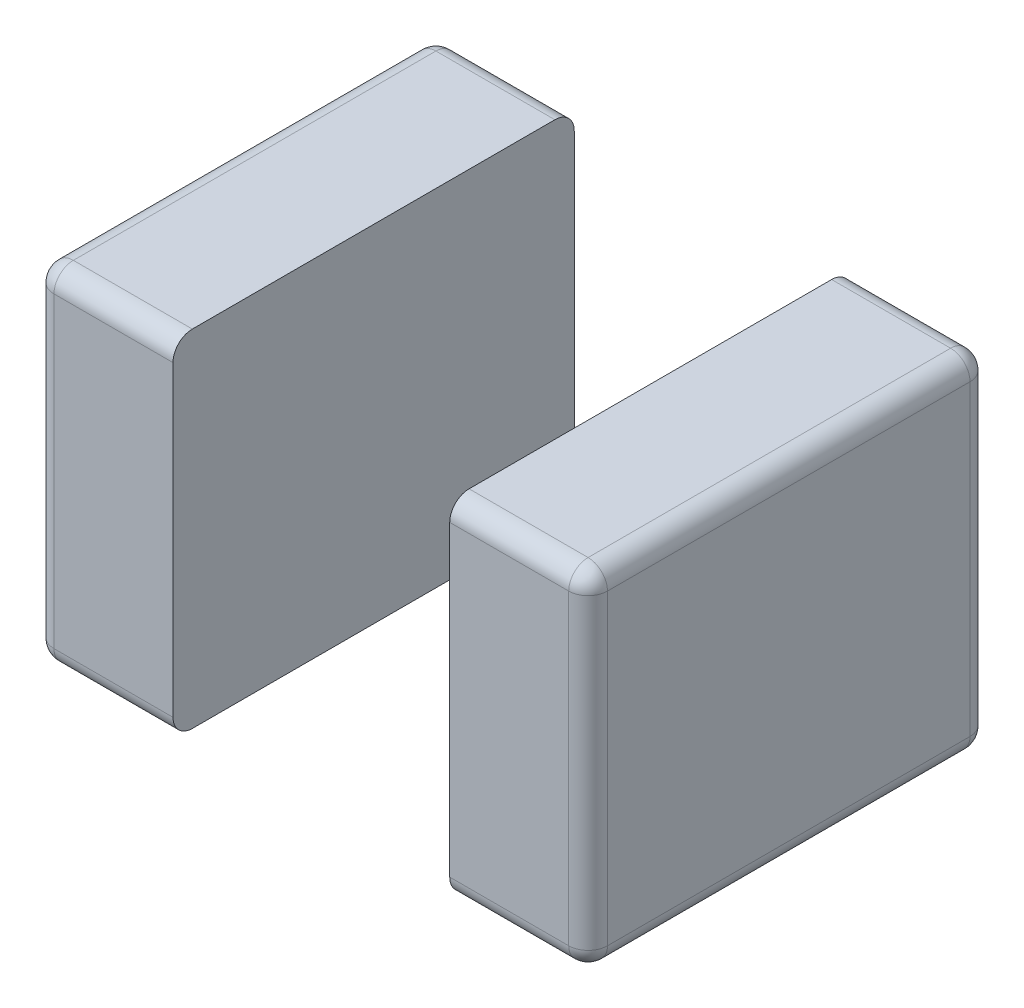
ISO-10303-21;
HEADER;
FILE_DESCRIPTION(('STEP AP214'),'2;1');
FILE_NAME('part.step','',(''),(''),'','','');
FILE_SCHEMA(('AUTOMOTIVE_DESIGN { 1 0 10303 214 1 1 1 1 }'));
ENDSEC;
DATA;
#1=APPLICATION_CONTEXT('core data for automotive mechanical design processes');
#2=APPLICATION_PROTOCOL_DEFINITION('international standard','automotive_design',2000,#1);
#3=PRODUCT_CONTEXT('',#1,'mechanical');
#4=PRODUCT('Part','Part','',(#3));
#5=PRODUCT_RELATED_PRODUCT_CATEGORY('part','',(#4));
#6=PRODUCT_DEFINITION_FORMATION('','',#4);
#7=PRODUCT_DEFINITION_CONTEXT('part definition',#1,'design');
#8=PRODUCT_DEFINITION('design','',#6,#7);
#9=PRODUCT_DEFINITION_SHAPE('','',#8);
#10=(LENGTH_UNIT() NAMED_UNIT(*) SI_UNIT(.MILLI.,.METRE.));
#11=(NAMED_UNIT(*) PLANE_ANGLE_UNIT() SI_UNIT($,.RADIAN.));
#12=(NAMED_UNIT(*) SI_UNIT($,.STERADIAN.) SOLID_ANGLE_UNIT());
#13=UNCERTAINTY_MEASURE_WITH_UNIT(LENGTH_MEASURE(1.E-05),#10,'distance_accuracy_value','');
#14=(GEOMETRIC_REPRESENTATION_CONTEXT(3) GLOBAL_UNCERTAINTY_ASSIGNED_CONTEXT((#13)) GLOBAL_UNIT_ASSIGNED_CONTEXT((#10,
#11,#12)) REPRESENTATION_CONTEXT('',''));
#15=CARTESIAN_POINT('',(0.,0.,0.));
#16=DIRECTION('',(0.,0.,1.));
#17=DIRECTION('',(1.,0.,0.));
#18=AXIS2_PLACEMENT_3D('',#15,#16,#17);
#19=CARTESIAN_POINT('',(-1.,0.625,0.));
#20=DIRECTION('',(-1.,0.,0.));
#21=DIRECTION('',(0.,-1.,0.));
#22=AXIS2_PLACEMENT_3D('',#19,#20,#21);
#23=PLANE('',#22);
#24=DIRECTION('',(0.,-1.,0.));
#25=VECTOR('',#24,1.);
#26=CARTESIAN_POINT('',(-1.,0.3125,1.38));
#27=LINE('',#26,#25);
#28=CARTESIAN_POINT('',(-1.,0.555,1.38));
#29=VERTEX_POINT('',#28);
#30=CARTESIAN_POINT('',(-1.,-0.555,1.38));
#31=VERTEX_POINT('',#30);
#32=EDGE_CURVE('P0_E183',#29,#31,#27,.T.);
#33=ORIENTED_EDGE('',*,*,#32,.F.);
#34=DIRECTION('',(0.,0.,1.));
#35=VECTOR('',#34,1.);
#36=CARTESIAN_POINT('',(-1.,0.555,0.));
#37=LINE('',#36,#35);
#38=CARTESIAN_POINT('',(-1.,0.555,0.07));
#39=VERTEX_POINT('',#38);
#40=EDGE_CURVE('P0_E103',#39,#29,#37,.T.);
#41=ORIENTED_EDGE('',*,*,#40,.F.);
#42=DIRECTION('',(0.,-1.,0.));
#43=VECTOR('',#42,1.);
#44=CARTESIAN_POINT('',(-1.,0.3125,0.07));
#45=LINE('',#44,#43);
#46=CARTESIAN_POINT('',(-1.,-0.555,0.07));
#47=VERTEX_POINT('',#46);
#48=EDGE_CURVE('P0_E175',#47,#39,#45,.F.);
#49=ORIENTED_EDGE('',*,*,#48,.F.);
#50=DIRECTION('',(0.,0.,1.));
#51=VECTOR('',#50,1.);
#52=CARTESIAN_POINT('',(-1.,-0.555,0.));
#53=LINE('',#52,#51);
#54=EDGE_CURVE('P0_E179',#31,#47,#53,.F.);
#55=ORIENTED_EDGE('',*,*,#54,.F.);
#56=EDGE_LOOP('',(#33,#41,#49,#55));
#57=FACE_BOUND('',#56,.T.);
#58=ADVANCED_FACE('P0_F17',(#57),#23,.T.);
#59=CARTESIAN_POINT('',(-0.93,0.555,0.07));
#60=DIRECTION('',(-0.577350269189626,0.577350269189626,-0.577350269189626));
#61=DIRECTION('',(0.707106781186548,0.707106781186548,0.));
#62=AXIS2_PLACEMENT_3D('',#59,#60,#61);
#63=SPHERICAL_SURFACE('',#62,0.07);
#64=CARTESIAN_POINT('',(-0.970414518843274,0.595414518843274,0.0295854811567262));
#65=VERTEX_POINT('',#64);
#66=VERTEX_LOOP('',#65);
#67=FACE_BOUND('',#66,.T.);
#68=CARTESIAN_POINT('',(-0.93,0.555,0.07));
#69=DIRECTION('',(-1.,0.,0.));
#70=DIRECTION('',(0.,-1.,0.));
#71=AXIS2_PLACEMENT_3D('',#68,#69,#70);
#72=CIRCLE('',#71,0.07);
#73=CARTESIAN_POINT('',(-0.93,0.555,0.));
#74=VERTEX_POINT('',#73);
#75=CARTESIAN_POINT('',(-0.93,0.625,0.07));
#76=VERTEX_POINT('',#75);
#77=EDGE_CURVE('P0_E98',#74,#76,#72,.F.);
#78=ORIENTED_EDGE('',*,*,#77,.F.);
#79=CARTESIAN_POINT('',(-0.93,0.555,0.07));
#80=DIRECTION('',(0.,-1.,0.));
#81=DIRECTION('',(1.,0.,0.));
#82=AXIS2_PLACEMENT_3D('',#79,#80,#81);
#83=CIRCLE('',#82,0.07);
#84=EDGE_CURVE('P0_E100',#39,#74,#83,.T.);
#85=ORIENTED_EDGE('',*,*,#84,.F.);
#86=CARTESIAN_POINT('',(-0.93,0.555,0.07));
#87=DIRECTION('',(0.,0.,1.));
#88=DIRECTION('',(1.,0.,0.));
#89=AXIS2_PLACEMENT_3D('',#86,#87,#88);
#90=CIRCLE('',#89,0.07);
#91=EDGE_CURVE('P0_E20',#76,#39,#90,.T.);
#92=ORIENTED_EDGE('',*,*,#91,.F.);
#93=EDGE_LOOP('',(#78,#85,#92));
#94=FACE_BOUND('',#93,.T.);
#95=ADVANCED_FACE('P0_F97',(#67,#94),#63,.T.);
#96=CARTESIAN_POINT('',(-0.93,0.555,0.));
#97=DIRECTION('',(0.,0.,1.));
#98=DIRECTION('',(1.,0.,0.));
#99=AXIS2_PLACEMENT_3D('',#96,#97,#98);
#100=CYLINDRICAL_SURFACE('',#99,0.07);
#101=ORIENTED_EDGE('',*,*,#91,.T.);
#102=ORIENTED_EDGE('',*,*,#40,.T.);
#103=CARTESIAN_POINT('',(-0.93,0.555,1.38));
#104=DIRECTION('',(0.,0.,1.));
#105=DIRECTION('',(1.,0.,0.));
#106=AXIS2_PLACEMENT_3D('',#103,#104,#105);
#107=CIRCLE('',#106,0.07);
#108=CARTESIAN_POINT('',(-0.93,0.625,1.38));
#109=VERTEX_POINT('',#108);
#110=EDGE_CURVE('P0_E118',#109,#29,#107,.T.);
#111=ORIENTED_EDGE('',*,*,#110,.F.);
#112=DIRECTION('',(0.,0.,1.));
#113=VECTOR('',#112,1.);
#114=CARTESIAN_POINT('',(-0.93,0.625,0.));
#115=LINE('',#114,#113);
#116=EDGE_CURVE('P0_E115',#76,#109,#115,.T.);
#117=ORIENTED_EDGE('',*,*,#116,.F.);
#118=EDGE_LOOP('',(#101,#102,#111,#117));
#119=FACE_BOUND('',#118,.T.);
#120=ADVANCED_FACE('P0_F116',(#119),#100,.T.);
#121=CARTESIAN_POINT('',(-0.93,0.555,1.38));
#122=DIRECTION('',(-0.577350269189626,0.577350269189626,0.577350269189626));
#123=DIRECTION('',(-0.707106781186548,0.,-0.707106781186548));
#124=AXIS2_PLACEMENT_3D('',#121,#122,#123);
#125=SPHERICAL_SURFACE('',#124,0.07);
#126=CARTESIAN_POINT('',(-0.970414518843274,0.595414518843274,1.42041451884327));
#127=VERTEX_POINT('',#126);
#128=VERTEX_LOOP('',#127);
#129=FACE_BOUND('',#128,.T.);
#130=ORIENTED_EDGE('',*,*,#110,.T.);
#131=CARTESIAN_POINT('',(-0.93,0.555,1.38));
#132=DIRECTION('',(0.,-1.,0.));
#133=DIRECTION('',(1.,0.,0.));
#134=AXIS2_PLACEMENT_3D('',#131,#132,#133);
#135=CIRCLE('',#134,0.07);
#136=CARTESIAN_POINT('',(-0.93,0.555,1.45));
#137=VERTEX_POINT('',#136);
#138=EDGE_CURVE('P0_E186',#137,#29,#135,.T.);
#139=ORIENTED_EDGE('',*,*,#138,.F.);
#140=CARTESIAN_POINT('',(-0.93,0.555,1.38));
#141=DIRECTION('',(-1.,0.,0.));
#142=DIRECTION('',(0.,-1.,0.));
#143=AXIS2_PLACEMENT_3D('',#140,#141,#142);
#144=CIRCLE('',#143,0.07);
#145=EDGE_CURVE('P0_E206',#109,#137,#144,.F.);
#146=ORIENTED_EDGE('',*,*,#145,.F.);
#147=EDGE_LOOP('',(#130,#139,#146));
#148=FACE_BOUND('',#147,.T.);
#149=ADVANCED_FACE('P0_F166',(#129,#148),#125,.T.);
#150=CARTESIAN_POINT('',(-0.93,0.3125,1.38));
#151=DIRECTION('',(0.,-1.,0.));
#152=DIRECTION('',(1.,0.,0.));
#153=AXIS2_PLACEMENT_3D('',#150,#151,#152);
#154=CYLINDRICAL_SURFACE('',#153,0.07);
#155=ORIENTED_EDGE('',*,*,#138,.T.);
#156=ORIENTED_EDGE('',*,*,#32,.T.);
#157=CARTESIAN_POINT('',(-0.93,-0.555,1.38));
#158=DIRECTION('',(0.,-1.,0.));
#159=DIRECTION('',(1.,0.,0.));
#160=AXIS2_PLACEMENT_3D('',#157,#158,#159);
#161=CIRCLE('',#160,0.07);
#162=CARTESIAN_POINT('',(-0.93,-0.555,1.45));
#163=VERTEX_POINT('',#162);
#164=EDGE_CURVE('P0_E185',#163,#31,#161,.T.);
#165=ORIENTED_EDGE('',*,*,#164,.F.);
#166=DIRECTION('',(0.,1.,0.));
#167=VECTOR('',#166,1.);
#168=CARTESIAN_POINT('',(-0.93,0.,1.45));
#169=LINE('',#168,#167);
#170=EDGE_CURVE('P0_E159',#137,#163,#169,.F.);
#171=ORIENTED_EDGE('',*,*,#170,.F.);
#172=EDGE_LOOP('',(#155,#156,#165,#171));
#173=FACE_BOUND('',#172,.T.);
#174=ADVANCED_FACE('P0_F154',(#173),#154,.T.);
#175=CARTESIAN_POINT('',(-0.93,-0.555,1.38));
#176=DIRECTION('',(-0.577350269189626,-0.577350269189626,0.577350269189626));
#177=DIRECTION('',(-0.707106781186548,0.,-0.707106781186548));
#178=AXIS2_PLACEMENT_3D('',#175,#176,#177);
#179=SPHERICAL_SURFACE('',#178,0.07);
#180=CARTESIAN_POINT('',(-0.970414518843274,-0.595414518843274,1.42041451884327));
#181=VERTEX_POINT('',#180);
#182=VERTEX_LOOP('',#181);
#183=FACE_BOUND('',#182,.T.);
#184=CARTESIAN_POINT('',(-0.93,-0.555,1.38));
#185=DIRECTION('',(0.,0.,1.));
#186=DIRECTION('',(1.,0.,0.));
#187=AXIS2_PLACEMENT_3D('',#184,#185,#186);
#188=CIRCLE('',#187,0.07);
#189=CARTESIAN_POINT('',(-0.93,-0.625,1.38));
#190=VERTEX_POINT('',#189);
#191=EDGE_CURVE('P0_E182',#190,#31,#188,.F.);
#192=ORIENTED_EDGE('',*,*,#191,.F.);
#193=CARTESIAN_POINT('',(-0.93,-0.555,1.38));
#194=DIRECTION('',(1.,0.,0.));
#195=DIRECTION('',(0.,1.,0.));
#196=AXIS2_PLACEMENT_3D('',#193,#194,#195);
#197=CIRCLE('',#196,0.07);
#198=EDGE_CURVE('P0_E202',#163,#190,#197,.T.);
#199=ORIENTED_EDGE('',*,*,#198,.F.);
#200=ORIENTED_EDGE('',*,*,#164,.T.);
#201=EDGE_LOOP('',(#192,#199,#200));
#202=FACE_BOUND('',#201,.T.);
#203=ADVANCED_FACE('P0_F150',(#183,#202),#179,.T.);
#204=CARTESIAN_POINT('',(-0.93,-0.555,0.));
#205=DIRECTION('',(0.,0.,1.));
#206=DIRECTION('',(1.,0.,0.));
#207=AXIS2_PLACEMENT_3D('',#204,#205,#206);
#208=CYLINDRICAL_SURFACE('',#207,0.07);
#209=CARTESIAN_POINT('',(-0.93,-0.555,0.07));
#210=DIRECTION('',(0.,0.,1.));
#211=DIRECTION('',(1.,0.,0.));
#212=AXIS2_PLACEMENT_3D('',#209,#210,#211);
#213=CIRCLE('',#212,0.07);
#214=CARTESIAN_POINT('',(-0.93,-0.625,0.07));
#215=VERTEX_POINT('',#214);
#216=EDGE_CURVE('P0_E181',#215,#47,#213,.F.);
#217=ORIENTED_EDGE('',*,*,#216,.F.);
#218=DIRECTION('',(0.,0.,1.));
#219=VECTOR('',#218,1.);
#220=CARTESIAN_POINT('',(-0.93,-0.625,0.));
#221=LINE('',#220,#219);
#222=EDGE_CURVE('P0_E137',#190,#215,#221,.F.);
#223=ORIENTED_EDGE('',*,*,#222,.F.);
#224=ORIENTED_EDGE('',*,*,#191,.T.);
#225=ORIENTED_EDGE('',*,*,#54,.T.);
#226=EDGE_LOOP('',(#217,#223,#224,#225));
#227=FACE_BOUND('',#226,.T.);
#228=ADVANCED_FACE('P0_F145',(#227),#208,.T.);
#229=CARTESIAN_POINT('',(-0.93,-0.555,0.07));
#230=DIRECTION('',(-0.577350269189626,-0.577350269189626,-0.577350269189626));
#231=DIRECTION('',(0.,-0.707106781186548,0.707106781186548));
#232=AXIS2_PLACEMENT_3D('',#229,#230,#231);
#233=SPHERICAL_SURFACE('',#232,0.07);
#234=CARTESIAN_POINT('',(-0.970414518843274,-0.595414518843274,0.0295854811567262));
#235=VERTEX_POINT('',#234);
#236=VERTEX_LOOP('',#235);
#237=FACE_BOUND('',#236,.T.);
#238=CARTESIAN_POINT('',(-0.93,-0.555,0.07));
#239=DIRECTION('',(1.,0.,0.));
#240=DIRECTION('',(0.,1.,0.));
#241=AXIS2_PLACEMENT_3D('',#238,#239,#240);
#242=CIRCLE('',#241,0.07);
#243=CARTESIAN_POINT('',(-0.93,-0.555,0.));
#244=VERTEX_POINT('',#243);
#245=EDGE_CURVE('P0_E134',#215,#244,#242,.T.);
#246=ORIENTED_EDGE('',*,*,#245,.F.);
#247=ORIENTED_EDGE('',*,*,#216,.T.);
#248=CARTESIAN_POINT('',(-0.93,-0.555,0.07));
#249=DIRECTION('',(0.,-1.,0.));
#250=DIRECTION('',(1.,0.,0.));
#251=AXIS2_PLACEMENT_3D('',#248,#249,#250);
#252=CIRCLE('',#251,0.07);
#253=EDGE_CURVE('P0_E178',#244,#47,#252,.F.);
#254=ORIENTED_EDGE('',*,*,#253,.F.);
#255=EDGE_LOOP('',(#246,#247,#254));
#256=FACE_BOUND('',#255,.T.);
#257=ADVANCED_FACE('P0_F140',(#237,#256),#233,.T.);
#258=CARTESIAN_POINT('',(-0.93,0.3125,0.07));
#259=DIRECTION('',(0.,-1.,0.));
#260=DIRECTION('',(1.,0.,0.));
#261=AXIS2_PLACEMENT_3D('',#258,#259,#260);
#262=CYLINDRICAL_SURFACE('',#261,0.07);
#263=ORIENTED_EDGE('',*,*,#84,.T.);
#264=DIRECTION('',(0.,1.,0.));
#265=VECTOR('',#264,1.);
#266=CARTESIAN_POINT('',(-0.93,0.,0.));
#267=LINE('',#266,#265);
#268=EDGE_CURVE('P0_E131',#74,#244,#267,.F.);
#269=ORIENTED_EDGE('',*,*,#268,.T.);
#270=ORIENTED_EDGE('',*,*,#253,.T.);
#271=ORIENTED_EDGE('',*,*,#48,.T.);
#272=EDGE_LOOP('',(#263,#269,#270,#271));
#273=FACE_BOUND('',#272,.T.);
#274=ADVANCED_FACE('P0_F144',(#273),#262,.T.);
#275=CARTESIAN_POINT('',(-0.625,0.555,0.07));
#276=DIRECTION('',(-1.,0.,0.));
#277=DIRECTION('',(0.,-1.,0.));
#278=AXIS2_PLACEMENT_3D('',#275,#276,#277);
#279=CYLINDRICAL_SURFACE('',#278,0.07);
#280=ORIENTED_EDGE('',*,*,#77,.T.);
#281=DIRECTION('',(-1.,0.,0.));
#282=VECTOR('',#281,1.);
#283=CARTESIAN_POINT('',(-0.5,0.625,0.07));
#284=LINE('',#283,#282);
#285=CARTESIAN_POINT('',(-0.5,0.625,0.07));
#286=VERTEX_POINT('',#285);
#287=EDGE_CURVE('P0_E108',#286,#76,#284,.T.);
#288=ORIENTED_EDGE('',*,*,#287,.F.);
#289=CARTESIAN_POINT('',(-0.5,0.555,0.07));
#290=DIRECTION('',(-1.,0.,0.));
#291=DIRECTION('',(0.,-1.,0.));
#292=AXIS2_PLACEMENT_3D('',#289,#290,#291);
#293=CIRCLE('',#292,0.07);
#294=CARTESIAN_POINT('',(-0.5,0.555,0.));
#295=VERTEX_POINT('',#294);
#296=EDGE_CURVE('P0_E198',#295,#286,#293,.F.);
#297=ORIENTED_EDGE('',*,*,#296,.F.);
#298=DIRECTION('',(1.,0.,0.));
#299=VECTOR('',#298,1.);
#300=CARTESIAN_POINT('',(-0.75,0.555,0.));
#301=LINE('',#300,#299);
#302=EDGE_CURVE('P0_E111',#295,#74,#301,.F.);
#303=ORIENTED_EDGE('',*,*,#302,.T.);
#304=EDGE_LOOP('',(#280,#288,#297,#303));
#305=FACE_BOUND('',#304,.T.);
#306=ADVANCED_FACE('P0_F106',(#305),#279,.T.);
#307=CARTESIAN_POINT('',(-0.5,0.625,0.));
#308=DIRECTION('',(0.,1.,0.));
#309=DIRECTION('',(-1.,0.,0.));
#310=AXIS2_PLACEMENT_3D('',#307,#308,#309);
#311=PLANE('',#310);
#312=DIRECTION('',(-1.,0.,0.));
#313=VECTOR('',#312,1.);
#314=CARTESIAN_POINT('',(-0.625,0.625,1.38));
#315=LINE('',#314,#313);
#316=CARTESIAN_POINT('',(-0.5,0.625,1.38));
#317=VERTEX_POINT('',#316);
#318=EDGE_CURVE('P0_E121',#317,#109,#315,.T.);
#319=ORIENTED_EDGE('',*,*,#318,.F.);
#320=DIRECTION('',(0.,0.,1.));
#321=VECTOR('',#320,1.);
#322=CARTESIAN_POINT('',(-0.5,0.625,0.));
#323=LINE('',#322,#321);
#324=EDGE_CURVE('P0_E125',#286,#317,#323,.T.);
#325=ORIENTED_EDGE('',*,*,#324,.F.);
#326=ORIENTED_EDGE('',*,*,#287,.T.);
#327=ORIENTED_EDGE('',*,*,#116,.T.);
#328=EDGE_LOOP('',(#319,#325,#326,#327));
#329=FACE_BOUND('',#328,.T.);
#330=ADVANCED_FACE('P0_F123',(#329),#311,.T.);
#331=CARTESIAN_POINT('',(-0.625,0.555,1.38));
#332=DIRECTION('',(-1.,0.,0.));
#333=DIRECTION('',(0.,-1.,0.));
#334=AXIS2_PLACEMENT_3D('',#331,#332,#333);
#335=CYLINDRICAL_SURFACE('',#334,0.07);
#336=ORIENTED_EDGE('',*,*,#145,.T.);
#337=DIRECTION('',(1.,0.,0.));
#338=VECTOR('',#337,1.);
#339=CARTESIAN_POINT('',(-0.75,0.555,1.45));
#340=LINE('',#339,#338);
#341=CARTESIAN_POINT('',(-0.5,0.555,1.45));
#342=VERTEX_POINT('',#341);
#343=EDGE_CURVE('P0_E163',#342,#137,#340,.F.);
#344=ORIENTED_EDGE('',*,*,#343,.F.);
#345=CARTESIAN_POINT('',(-0.5,0.555,1.38));
#346=DIRECTION('',(-1.,0.,0.));
#347=DIRECTION('',(0.,-1.,0.));
#348=AXIS2_PLACEMENT_3D('',#345,#346,#347);
#349=CIRCLE('',#348,0.07);
#350=EDGE_CURVE('P0_E195',#317,#342,#349,.F.);
#351=ORIENTED_EDGE('',*,*,#350,.F.);
#352=ORIENTED_EDGE('',*,*,#318,.T.);
#353=EDGE_LOOP('',(#336,#344,#351,#352));
#354=FACE_BOUND('',#353,.T.);
#355=ADVANCED_FACE('P0_F311',(#354),#335,.T.);
#356=CARTESIAN_POINT('',(-0.75,0.,1.45));
#357=DIRECTION('',(0.,0.,1.));
#358=DIRECTION('',(1.,0.,0.));
#359=AXIS2_PLACEMENT_3D('',#356,#357,#358);
#360=PLANE('',#359);
#361=DIRECTION('',(1.,0.,0.));
#362=VECTOR('',#361,1.);
#363=CARTESIAN_POINT('',(-0.875,-0.555,1.45));
#364=LINE('',#363,#362);
#365=CARTESIAN_POINT('',(-0.5,-0.555,1.45));
#366=VERTEX_POINT('',#365);
#367=EDGE_CURVE('P0_E162',#366,#163,#364,.F.);
#368=ORIENTED_EDGE('',*,*,#367,.F.);
#369=DIRECTION('',(0.,1.,0.));
#370=VECTOR('',#369,1.);
#371=CARTESIAN_POINT('',(-0.5,-0.625,1.45));
#372=LINE('',#371,#370);
#373=EDGE_CURVE('P0_E194',#342,#366,#372,.F.);
#374=ORIENTED_EDGE('',*,*,#373,.F.);
#375=ORIENTED_EDGE('',*,*,#343,.T.);
#376=ORIENTED_EDGE('',*,*,#170,.T.);
#377=EDGE_LOOP('',(#368,#374,#375,#376));
#378=FACE_BOUND('',#377,.T.);
#379=ADVANCED_FACE('P0_F232',(#378),#360,.T.);
#380=CARTESIAN_POINT('',(-0.875,-0.555,1.38));
#381=DIRECTION('',(1.,0.,0.));
#382=DIRECTION('',(0.,1.,0.));
#383=AXIS2_PLACEMENT_3D('',#380,#381,#382);
#384=CYLINDRICAL_SURFACE('',#383,0.07);
#385=ORIENTED_EDGE('',*,*,#198,.T.);
#386=DIRECTION('',(1.,0.,0.));
#387=VECTOR('',#386,1.);
#388=CARTESIAN_POINT('',(-1.,-0.625,1.38));
#389=LINE('',#388,#387);
#390=CARTESIAN_POINT('',(-0.5,-0.625,1.38));
#391=VERTEX_POINT('',#390);
#392=EDGE_CURVE('P0_E205',#391,#190,#389,.F.);
#393=ORIENTED_EDGE('',*,*,#392,.F.);
#394=CARTESIAN_POINT('',(-0.5,-0.555,1.38));
#395=DIRECTION('',(1.,0.,0.));
#396=DIRECTION('',(0.,1.,0.));
#397=AXIS2_PLACEMENT_3D('',#394,#395,#396);
#398=CIRCLE('',#397,0.07);
#399=EDGE_CURVE('P0_E191',#366,#391,#398,.T.);
#400=ORIENTED_EDGE('',*,*,#399,.F.);
#401=ORIENTED_EDGE('',*,*,#367,.T.);
#402=EDGE_LOOP('',(#385,#393,#400,#401));
#403=FACE_BOUND('',#402,.T.);
#404=ADVANCED_FACE('P0_F268',(#403),#384,.T.);
#405=CARTESIAN_POINT('',(-1.,-0.625,0.));
#406=DIRECTION('',(0.,-1.,0.));
#407=DIRECTION('',(1.,0.,0.));
#408=AXIS2_PLACEMENT_3D('',#405,#406,#407);
#409=PLANE('',#408);
#410=ORIENTED_EDGE('',*,*,#392,.T.);
#411=ORIENTED_EDGE('',*,*,#222,.T.);
#412=DIRECTION('',(1.,0.,0.));
#413=VECTOR('',#412,1.);
#414=CARTESIAN_POINT('',(-0.875,-0.625,0.07));
#415=LINE('',#414,#413);
#416=CARTESIAN_POINT('',(-0.5,-0.625,0.07));
#417=VERTEX_POINT('',#416);
#418=EDGE_CURVE('P0_E201',#417,#215,#415,.F.);
#419=ORIENTED_EDGE('',*,*,#418,.F.);
#420=DIRECTION('',(0.,0.,1.));
#421=VECTOR('',#420,1.);
#422=CARTESIAN_POINT('',(-0.5,-0.625,0.));
#423=LINE('',#422,#421);
#424=EDGE_CURVE('P0_E190',#391,#417,#423,.F.);
#425=ORIENTED_EDGE('',*,*,#424,.F.);
#426=EDGE_LOOP('',(#410,#411,#419,#425));
#427=FACE_BOUND('',#426,.T.);
#428=ADVANCED_FACE('P0_F253',(#427),#409,.T.);
#429=CARTESIAN_POINT('',(-0.875,-0.555,0.07));
#430=DIRECTION('',(1.,0.,0.));
#431=DIRECTION('',(0.,1.,0.));
#432=AXIS2_PLACEMENT_3D('',#429,#430,#431);
#433=CYLINDRICAL_SURFACE('',#432,0.07);
#434=ORIENTED_EDGE('',*,*,#245,.T.);
#435=DIRECTION('',(1.,0.,0.));
#436=VECTOR('',#435,1.);
#437=CARTESIAN_POINT('',(-0.75,-0.555,0.));
#438=LINE('',#437,#436);
#439=CARTESIAN_POINT('',(-0.5,-0.555,0.));
#440=VERTEX_POINT('',#439);
#441=EDGE_CURVE('P0_E35',#244,#440,#438,.T.);
#442=ORIENTED_EDGE('',*,*,#441,.T.);
#443=CARTESIAN_POINT('',(-0.5,-0.555,0.07));
#444=DIRECTION('',(1.,0.,0.));
#445=DIRECTION('',(0.,1.,0.));
#446=AXIS2_PLACEMENT_3D('',#443,#444,#445);
#447=CIRCLE('',#446,0.07);
#448=EDGE_CURVE('P0_E26',#417,#440,#447,.T.);
#449=ORIENTED_EDGE('',*,*,#448,.F.);
#450=ORIENTED_EDGE('',*,*,#418,.T.);
#451=EDGE_LOOP('',(#434,#442,#449,#450));
#452=FACE_BOUND('',#451,.T.);
#453=ADVANCED_FACE('P0_F257',(#452),#433,.T.);
#454=CARTESIAN_POINT('',(-0.75,0.,0.));
#455=DIRECTION('',(0.,0.,1.));
#456=DIRECTION('',(1.,0.,0.));
#457=AXIS2_PLACEMENT_3D('',#454,#455,#456);
#458=PLANE('',#457);
#459=DIRECTION('',(0.,1.,0.));
#460=VECTOR('',#459,1.);
#461=CARTESIAN_POINT('',(-0.5,-0.625,0.));
#462=LINE('',#461,#460);
#463=EDGE_CURVE('P0_E11',#440,#295,#462,.T.);
#464=ORIENTED_EDGE('',*,*,#463,.F.);
#465=ORIENTED_EDGE('',*,*,#441,.F.);
#466=ORIENTED_EDGE('',*,*,#268,.F.);
#467=ORIENTED_EDGE('',*,*,#302,.F.);
#468=EDGE_LOOP('',(#464,#465,#466,#467));
#469=FACE_BOUND('',#468,.T.);
#470=ADVANCED_FACE('P0_F259',(#469),#458,.F.);
#471=CARTESIAN_POINT('',(-0.5,-0.625,0.));
#472=DIRECTION('',(1.,0.,0.));
#473=DIRECTION('',(0.,1.,0.));
#474=AXIS2_PLACEMENT_3D('',#471,#472,#473);
#475=PLANE('',#474);
#476=ORIENTED_EDGE('',*,*,#448,.T.);
#477=ORIENTED_EDGE('',*,*,#463,.T.);
#478=ORIENTED_EDGE('',*,*,#296,.T.);
#479=ORIENTED_EDGE('',*,*,#324,.T.);
#480=ORIENTED_EDGE('',*,*,#350,.T.);
#481=ORIENTED_EDGE('',*,*,#373,.T.);
#482=ORIENTED_EDGE('',*,*,#399,.T.);
#483=ORIENTED_EDGE('',*,*,#424,.T.);
#484=EDGE_LOOP('',(#476,#477,#478,#479,#480,#481,#482,#483));
#485=FACE_BOUND('',#484,.T.);
#486=ADVANCED_FACE('P0_F250',(#485),#475,.T.);
#487=CLOSED_SHELL('',(#58,#95,#120,#149,#174,#203,#228,#257,#274,#306,#330,#355,#379,#404,#428,
#453,#470,#486));
#488=MANIFOLD_SOLID_BREP('P0_B1',#487);
#489=CARTESIAN_POINT('',(1.,-0.625,0.));
#490=DIRECTION('',(1.,0.,0.));
#491=DIRECTION('',(0.,1.,0.));
#492=AXIS2_PLACEMENT_3D('',#489,#490,#491);
#493=PLANE('',#492);
#494=DIRECTION('',(0.,0.,1.));
#495=VECTOR('',#494,1.);
#496=CARTESIAN_POINT('',(1.,-0.555,0.));
#497=LINE('',#496,#495);
#498=CARTESIAN_POINT('',(1.,-0.555,0.07));
#499=VERTEX_POINT('',#498);
#500=CARTESIAN_POINT('',(1.,-0.555,1.38));
#501=VERTEX_POINT('',#500);
#502=EDGE_CURVE('P1_E103',#499,#501,#497,.T.);
#503=ORIENTED_EDGE('',*,*,#502,.F.);
#504=DIRECTION('',(0.,1.,0.));
#505=VECTOR('',#504,1.);
#506=CARTESIAN_POINT('',(1.,-0.3125,0.07));
#507=LINE('',#506,#505);
#508=CARTESIAN_POINT('',(1.,0.555,0.07));
#509=VERTEX_POINT('',#508);
#510=EDGE_CURVE('P1_E175',#509,#499,#507,.F.);
#511=ORIENTED_EDGE('',*,*,#510,.F.);
#512=DIRECTION('',(0.,0.,1.));
#513=VECTOR('',#512,1.);
#514=CARTESIAN_POINT('',(1.,0.555,0.));
#515=LINE('',#514,#513);
#516=CARTESIAN_POINT('',(1.,0.555,1.38));
#517=VERTEX_POINT('',#516);
#518=EDGE_CURVE('P1_E179',#517,#509,#515,.F.);
#519=ORIENTED_EDGE('',*,*,#518,.F.);
#520=DIRECTION('',(0.,1.,0.));
#521=VECTOR('',#520,1.);
#522=CARTESIAN_POINT('',(1.,-0.3125,1.38));
#523=LINE('',#522,#521);
#524=EDGE_CURVE('P1_E183',#501,#517,#523,.T.);
#525=ORIENTED_EDGE('',*,*,#524,.F.);
#526=EDGE_LOOP('',(#503,#511,#519,#525));
#527=FACE_BOUND('',#526,.T.);
#528=ADVANCED_FACE('P1_F17',(#527),#493,.T.);
#529=CARTESIAN_POINT('',(0.93,-0.555,0.07));
#530=DIRECTION('',(0.577350269189626,-0.577350269189626,-0.577350269189626));
#531=DIRECTION('',(-0.707106781186548,-0.707106781186548,0.));
#532=AXIS2_PLACEMENT_3D('',#529,#530,#531);
#533=SPHERICAL_SURFACE('',#532,0.07);
#534=CARTESIAN_POINT('',(0.970414518843274,-0.595414518843274,0.0295854811567262));
#535=VERTEX_POINT('',#534);
#536=VERTEX_LOOP('',#535);
#537=FACE_BOUND('',#536,.T.);
#538=CARTESIAN_POINT('',(0.93,-0.555,0.07));
#539=DIRECTION('',(1.,0.,0.));
#540=DIRECTION('',(0.,1.,0.));
#541=AXIS2_PLACEMENT_3D('',#538,#539,#540);
#542=CIRCLE('',#541,0.07);
#543=CARTESIAN_POINT('',(0.93,-0.555,0.));
#544=VERTEX_POINT('',#543);
#545=CARTESIAN_POINT('',(0.93,-0.625,0.07));
#546=VERTEX_POINT('',#545);
#547=EDGE_CURVE('P1_E98',#544,#546,#542,.F.);
#548=ORIENTED_EDGE('',*,*,#547,.F.);
#549=CARTESIAN_POINT('',(0.93,-0.555,0.07));
#550=DIRECTION('',(0.,1.,0.));
#551=DIRECTION('',(-1.,0.,0.));
#552=AXIS2_PLACEMENT_3D('',#549,#550,#551);
#553=CIRCLE('',#552,0.07);
#554=EDGE_CURVE('P1_E100',#499,#544,#553,.T.);
#555=ORIENTED_EDGE('',*,*,#554,.F.);
#556=CARTESIAN_POINT('',(0.93,-0.555,0.07));
#557=DIRECTION('',(0.,0.,1.));
#558=DIRECTION('',(1.,0.,0.));
#559=AXIS2_PLACEMENT_3D('',#556,#557,#558);
#560=CIRCLE('',#559,0.07);
#561=EDGE_CURVE('P1_E20',#546,#499,#560,.T.);
#562=ORIENTED_EDGE('',*,*,#561,.F.);
#563=EDGE_LOOP('',(#548,#555,#562));
#564=FACE_BOUND('',#563,.T.);
#565=ADVANCED_FACE('P1_F97',(#537,#564),#533,.T.);
#566=CARTESIAN_POINT('',(0.93,-0.555,0.));
#567=DIRECTION('',(0.,0.,1.));
#568=DIRECTION('',(1.,0.,0.));
#569=AXIS2_PLACEMENT_3D('',#566,#567,#568);
#570=CYLINDRICAL_SURFACE('',#569,0.07);
#571=ORIENTED_EDGE('',*,*,#561,.T.);
#572=ORIENTED_EDGE('',*,*,#502,.T.);
#573=CARTESIAN_POINT('',(0.93,-0.555,1.38));
#574=DIRECTION('',(0.,0.,1.));
#575=DIRECTION('',(1.,0.,0.));
#576=AXIS2_PLACEMENT_3D('',#573,#574,#575);
#577=CIRCLE('',#576,0.07);
#578=CARTESIAN_POINT('',(0.93,-0.625,1.38));
#579=VERTEX_POINT('',#578);
#580=EDGE_CURVE('P1_E118',#579,#501,#577,.T.);
#581=ORIENTED_EDGE('',*,*,#580,.F.);
#582=DIRECTION('',(0.,0.,1.));
#583=VECTOR('',#582,1.);
#584=CARTESIAN_POINT('',(0.93,-0.625,0.));
#585=LINE('',#584,#583);
#586=EDGE_CURVE('P1_E115',#546,#579,#585,.T.);
#587=ORIENTED_EDGE('',*,*,#586,.F.);
#588=EDGE_LOOP('',(#571,#572,#581,#587));
#589=FACE_BOUND('',#588,.T.);
#590=ADVANCED_FACE('P1_F116',(#589),#570,.T.);
#591=CARTESIAN_POINT('',(0.93,-0.555,1.38));
#592=DIRECTION('',(0.577350269189626,-0.577350269189626,0.577350269189626));
#593=DIRECTION('',(0.,0.707106781186548,0.707106781186548));
#594=AXIS2_PLACEMENT_3D('',#591,#592,#593);
#595=SPHERICAL_SURFACE('',#594,0.07);
#596=CARTESIAN_POINT('',(0.970414518843274,-0.595414518843274,1.42041451884327));
#597=VERTEX_POINT('',#596);
#598=VERTEX_LOOP('',#597);
#599=FACE_BOUND('',#598,.T.);
#600=ORIENTED_EDGE('',*,*,#580,.T.);
#601=CARTESIAN_POINT('',(0.93,-0.555,1.38));
#602=DIRECTION('',(0.,1.,0.));
#603=DIRECTION('',(-1.,0.,0.));
#604=AXIS2_PLACEMENT_3D('',#601,#602,#603);
#605=CIRCLE('',#604,0.07);
#606=CARTESIAN_POINT('',(0.93,-0.555,1.45));
#607=VERTEX_POINT('',#606);
#608=EDGE_CURVE('P1_E186',#607,#501,#605,.T.);
#609=ORIENTED_EDGE('',*,*,#608,.F.);
#610=CARTESIAN_POINT('',(0.93,-0.555,1.38));
#611=DIRECTION('',(1.,0.,0.));
#612=DIRECTION('',(0.,1.,0.));
#613=AXIS2_PLACEMENT_3D('',#610,#611,#612);
#614=CIRCLE('',#613,0.07);
#615=EDGE_CURVE('P1_E206',#579,#607,#614,.F.);
#616=ORIENTED_EDGE('',*,*,#615,.F.);
#617=EDGE_LOOP('',(#600,#609,#616));
#618=FACE_BOUND('',#617,.T.);
#619=ADVANCED_FACE('P1_F166',(#599,#618),#595,.T.);
#620=CARTESIAN_POINT('',(0.93,-0.3125,1.38));
#621=DIRECTION('',(0.,1.,0.));
#622=DIRECTION('',(-1.,0.,0.));
#623=AXIS2_PLACEMENT_3D('',#620,#621,#622);
#624=CYLINDRICAL_SURFACE('',#623,0.07);
#625=ORIENTED_EDGE('',*,*,#608,.T.);
#626=ORIENTED_EDGE('',*,*,#524,.T.);
#627=CARTESIAN_POINT('',(0.93,0.555,1.38));
#628=DIRECTION('',(0.,1.,0.));
#629=DIRECTION('',(-1.,0.,0.));
#630=AXIS2_PLACEMENT_3D('',#627,#628,#629);
#631=CIRCLE('',#630,0.07);
#632=CARTESIAN_POINT('',(0.93,0.555,1.45));
#633=VERTEX_POINT('',#632);
#634=EDGE_CURVE('P1_E185',#633,#517,#631,.T.);
#635=ORIENTED_EDGE('',*,*,#634,.F.);
#636=DIRECTION('',(0.,1.,0.));
#637=VECTOR('',#636,1.);
#638=CARTESIAN_POINT('',(0.93,0.,1.45));
#639=LINE('',#638,#637);
#640=EDGE_CURVE('P1_E159',#607,#633,#639,.T.);
#641=ORIENTED_EDGE('',*,*,#640,.F.);
#642=EDGE_LOOP('',(#625,#626,#635,#641));
#643=FACE_BOUND('',#642,.T.);
#644=ADVANCED_FACE('P1_F154',(#643),#624,.T.);
#645=CARTESIAN_POINT('',(0.93,0.555,1.38));
#646=DIRECTION('',(0.577350269189626,0.577350269189626,0.577350269189626));
#647=DIRECTION('',(-0.707106781186548,0.,0.707106781186548));
#648=AXIS2_PLACEMENT_3D('',#645,#646,#647);
#649=SPHERICAL_SURFACE('',#648,0.07);
#650=CARTESIAN_POINT('',(0.970414518843274,0.595414518843274,1.42041451884327));
#651=VERTEX_POINT('',#650);
#652=VERTEX_LOOP('',#651);
#653=FACE_BOUND('',#652,.T.);
#654=CARTESIAN_POINT('',(0.93,0.555,1.38));
#655=DIRECTION('',(0.,0.,1.));
#656=DIRECTION('',(1.,0.,0.));
#657=AXIS2_PLACEMENT_3D('',#654,#655,#656);
#658=CIRCLE('',#657,0.07);
#659=CARTESIAN_POINT('',(0.93,0.625,1.38));
#660=VERTEX_POINT('',#659);
#661=EDGE_CURVE('P1_E182',#660,#517,#658,.F.);
#662=ORIENTED_EDGE('',*,*,#661,.F.);
#663=CARTESIAN_POINT('',(0.93,0.555,1.38));
#664=DIRECTION('',(-1.,0.,0.));
#665=DIRECTION('',(0.,-1.,0.));
#666=AXIS2_PLACEMENT_3D('',#663,#664,#665);
#667=CIRCLE('',#666,0.07);
#668=EDGE_CURVE('P1_E202',#633,#660,#667,.T.);
#669=ORIENTED_EDGE('',*,*,#668,.F.);
#670=ORIENTED_EDGE('',*,*,#634,.T.);
#671=EDGE_LOOP('',(#662,#669,#670));
#672=FACE_BOUND('',#671,.T.);
#673=ADVANCED_FACE('P1_F150',(#653,#672),#649,.T.);
#674=CARTESIAN_POINT('',(0.93,0.555,0.));
#675=DIRECTION('',(0.,0.,1.));
#676=DIRECTION('',(1.,0.,0.));
#677=AXIS2_PLACEMENT_3D('',#674,#675,#676);
#678=CYLINDRICAL_SURFACE('',#677,0.07);
#679=CARTESIAN_POINT('',(0.93,0.555,0.07));
#680=DIRECTION('',(0.,0.,1.));
#681=DIRECTION('',(1.,0.,0.));
#682=AXIS2_PLACEMENT_3D('',#679,#680,#681);
#683=CIRCLE('',#682,0.07);
#684=CARTESIAN_POINT('',(0.93,0.625,0.07));
#685=VERTEX_POINT('',#684);
#686=EDGE_CURVE('P1_E181',#685,#509,#683,.F.);
#687=ORIENTED_EDGE('',*,*,#686,.F.);
#688=DIRECTION('',(0.,0.,1.));
#689=VECTOR('',#688,1.);
#690=CARTESIAN_POINT('',(0.93,0.625,0.));
#691=LINE('',#690,#689);
#692=EDGE_CURVE('P1_E137',#660,#685,#691,.F.);
#693=ORIENTED_EDGE('',*,*,#692,.F.);
#694=ORIENTED_EDGE('',*,*,#661,.T.);
#695=ORIENTED_EDGE('',*,*,#518,.T.);
#696=EDGE_LOOP('',(#687,#693,#694,#695));
#697=FACE_BOUND('',#696,.T.);
#698=ADVANCED_FACE('P1_F145',(#697),#678,.T.);
#699=CARTESIAN_POINT('',(0.93,0.555,0.07));
#700=DIRECTION('',(0.577350269189626,0.577350269189626,-0.577350269189626));
#701=DIRECTION('',(0.,-0.707106781186548,-0.707106781186548));
#702=AXIS2_PLACEMENT_3D('',#699,#700,#701);
#703=SPHERICAL_SURFACE('',#702,0.07);
#704=CARTESIAN_POINT('',(0.970414518843274,0.595414518843274,0.0295854811567262));
#705=VERTEX_POINT('',#704);
#706=VERTEX_LOOP('',#705);
#707=FACE_BOUND('',#706,.T.);
#708=CARTESIAN_POINT('',(0.93,0.555,0.07));
#709=DIRECTION('',(-1.,0.,0.));
#710=DIRECTION('',(0.,-1.,0.));
#711=AXIS2_PLACEMENT_3D('',#708,#709,#710);
#712=CIRCLE('',#711,0.07);
#713=CARTESIAN_POINT('',(0.93,0.555,0.));
#714=VERTEX_POINT('',#713);
#715=EDGE_CURVE('P1_E134',#685,#714,#712,.T.);
#716=ORIENTED_EDGE('',*,*,#715,.F.);
#717=ORIENTED_EDGE('',*,*,#686,.T.);
#718=CARTESIAN_POINT('',(0.93,0.555,0.07));
#719=DIRECTION('',(0.,1.,0.));
#720=DIRECTION('',(-1.,0.,0.));
#721=AXIS2_PLACEMENT_3D('',#718,#719,#720);
#722=CIRCLE('',#721,0.07);
#723=EDGE_CURVE('P1_E178',#714,#509,#722,.F.);
#724=ORIENTED_EDGE('',*,*,#723,.F.);
#725=EDGE_LOOP('',(#716,#717,#724));
#726=FACE_BOUND('',#725,.T.);
#727=ADVANCED_FACE('P1_F140',(#707,#726),#703,.T.);
#728=CARTESIAN_POINT('',(0.93,-0.3125,0.07));
#729=DIRECTION('',(0.,1.,0.));
#730=DIRECTION('',(-1.,0.,0.));
#731=AXIS2_PLACEMENT_3D('',#728,#729,#730);
#732=CYLINDRICAL_SURFACE('',#731,0.07);
#733=ORIENTED_EDGE('',*,*,#554,.T.);
#734=DIRECTION('',(0.,1.,0.));
#735=VECTOR('',#734,1.);
#736=CARTESIAN_POINT('',(0.93,0.,0.));
#737=LINE('',#736,#735);
#738=EDGE_CURVE('P1_E131',#544,#714,#737,.T.);
#739=ORIENTED_EDGE('',*,*,#738,.T.);
#740=ORIENTED_EDGE('',*,*,#723,.T.);
#741=ORIENTED_EDGE('',*,*,#510,.T.);
#742=EDGE_LOOP('',(#733,#739,#740,#741));
#743=FACE_BOUND('',#742,.T.);
#744=ADVANCED_FACE('P1_F144',(#743),#732,.T.);
#745=CARTESIAN_POINT('',(0.625,-0.555,0.07));
#746=DIRECTION('',(1.,0.,0.));
#747=DIRECTION('',(0.,1.,0.));
#748=AXIS2_PLACEMENT_3D('',#745,#746,#747);
#749=CYLINDRICAL_SURFACE('',#748,0.07);
#750=ORIENTED_EDGE('',*,*,#547,.T.);
#751=DIRECTION('',(1.,0.,0.));
#752=VECTOR('',#751,1.);
#753=CARTESIAN_POINT('',(0.5,-0.625,0.07));
#754=LINE('',#753,#752);
#755=CARTESIAN_POINT('',(0.5,-0.625,0.07));
#756=VERTEX_POINT('',#755);
#757=EDGE_CURVE('P1_E108',#756,#546,#754,.T.);
#758=ORIENTED_EDGE('',*,*,#757,.F.);
#759=CARTESIAN_POINT('',(0.5,-0.555,0.07));
#760=DIRECTION('',(1.,0.,0.));
#761=DIRECTION('',(0.,1.,0.));
#762=AXIS2_PLACEMENT_3D('',#759,#760,#761);
#763=CIRCLE('',#762,0.07);
#764=CARTESIAN_POINT('',(0.5,-0.555,0.));
#765=VERTEX_POINT('',#764);
#766=EDGE_CURVE('P1_E198',#765,#756,#763,.F.);
#767=ORIENTED_EDGE('',*,*,#766,.F.);
#768=DIRECTION('',(1.,0.,0.));
#769=VECTOR('',#768,1.);
#770=CARTESIAN_POINT('',(0.75,-0.555,0.));
#771=LINE('',#770,#769);
#772=EDGE_CURVE('P1_E111',#765,#544,#771,.T.);
#773=ORIENTED_EDGE('',*,*,#772,.T.);
#774=EDGE_LOOP('',(#750,#758,#767,#773));
#775=FACE_BOUND('',#774,.T.);
#776=ADVANCED_FACE('P1_F106',(#775),#749,.T.);
#777=CARTESIAN_POINT('',(0.5,-0.625,0.));
#778=DIRECTION('',(0.,-1.,0.));
#779=DIRECTION('',(1.,0.,0.));
#780=AXIS2_PLACEMENT_3D('',#777,#778,#779);
#781=PLANE('',#780);
#782=DIRECTION('',(1.,0.,0.));
#783=VECTOR('',#782,1.);
#784=CARTESIAN_POINT('',(0.625,-0.625,1.38));
#785=LINE('',#784,#783);
#786=CARTESIAN_POINT('',(0.5,-0.625,1.38));
#787=VERTEX_POINT('',#786);
#788=EDGE_CURVE('P1_E121',#787,#579,#785,.T.);
#789=ORIENTED_EDGE('',*,*,#788,.F.);
#790=DIRECTION('',(0.,0.,1.));
#791=VECTOR('',#790,1.);
#792=CARTESIAN_POINT('',(0.5,-0.625,0.));
#793=LINE('',#792,#791);
#794=EDGE_CURVE('P1_E125',#756,#787,#793,.T.);
#795=ORIENTED_EDGE('',*,*,#794,.F.);
#796=ORIENTED_EDGE('',*,*,#757,.T.);
#797=ORIENTED_EDGE('',*,*,#586,.T.);
#798=EDGE_LOOP('',(#789,#795,#796,#797));
#799=FACE_BOUND('',#798,.T.);
#800=ADVANCED_FACE('P1_F123',(#799),#781,.T.);
#801=CARTESIAN_POINT('',(0.625,-0.555,1.38));
#802=DIRECTION('',(1.,0.,0.));
#803=DIRECTION('',(0.,1.,0.));
#804=AXIS2_PLACEMENT_3D('',#801,#802,#803);
#805=CYLINDRICAL_SURFACE('',#804,0.07);
#806=ORIENTED_EDGE('',*,*,#615,.T.);
#807=DIRECTION('',(1.,0.,0.));
#808=VECTOR('',#807,1.);
#809=CARTESIAN_POINT('',(0.75,-0.555,1.45));
#810=LINE('',#809,#808);
#811=CARTESIAN_POINT('',(0.5,-0.555,1.45));
#812=VERTEX_POINT('',#811);
#813=EDGE_CURVE('P1_E163',#812,#607,#810,.T.);
#814=ORIENTED_EDGE('',*,*,#813,.F.);
#815=CARTESIAN_POINT('',(0.5,-0.555,1.38));
#816=DIRECTION('',(1.,0.,0.));
#817=DIRECTION('',(0.,1.,0.));
#818=AXIS2_PLACEMENT_3D('',#815,#816,#817);
#819=CIRCLE('',#818,0.07);
#820=EDGE_CURVE('P1_E195',#787,#812,#819,.F.);
#821=ORIENTED_EDGE('',*,*,#820,.F.);
#822=ORIENTED_EDGE('',*,*,#788,.T.);
#823=EDGE_LOOP('',(#806,#814,#821,#822));
#824=FACE_BOUND('',#823,.T.);
#825=ADVANCED_FACE('P1_F311',(#824),#805,.T.);
#826=CARTESIAN_POINT('',(0.75,0.,1.45));
#827=DIRECTION('',(0.,0.,1.));
#828=DIRECTION('',(1.,0.,0.));
#829=AXIS2_PLACEMENT_3D('',#826,#827,#828);
#830=PLANE('',#829);
#831=DIRECTION('',(-1.,0.,0.));
#832=VECTOR('',#831,1.);
#833=CARTESIAN_POINT('',(0.875,0.555,1.45));
#834=LINE('',#833,#832);
#835=CARTESIAN_POINT('',(0.5,0.555,1.45));
#836=VERTEX_POINT('',#835);
#837=EDGE_CURVE('P1_E162',#836,#633,#834,.F.);
#838=ORIENTED_EDGE('',*,*,#837,.F.);
#839=DIRECTION('',(0.,-1.,0.));
#840=VECTOR('',#839,1.);
#841=CARTESIAN_POINT('',(0.5,0.625,1.45));
#842=LINE('',#841,#840);
#843=EDGE_CURVE('P1_E194',#812,#836,#842,.F.);
#844=ORIENTED_EDGE('',*,*,#843,.F.);
#845=ORIENTED_EDGE('',*,*,#813,.T.);
#846=ORIENTED_EDGE('',*,*,#640,.T.);
#847=EDGE_LOOP('',(#838,#844,#845,#846));
#848=FACE_BOUND('',#847,.T.);
#849=ADVANCED_FACE('P1_F232',(#848),#830,.T.);
#850=CARTESIAN_POINT('',(0.875,0.555,1.38));
#851=DIRECTION('',(-1.,0.,0.));
#852=DIRECTION('',(0.,-1.,0.));
#853=AXIS2_PLACEMENT_3D('',#850,#851,#852);
#854=CYLINDRICAL_SURFACE('',#853,0.07);
#855=ORIENTED_EDGE('',*,*,#668,.T.);
#856=DIRECTION('',(-1.,0.,0.));
#857=VECTOR('',#856,1.);
#858=CARTESIAN_POINT('',(1.,0.625,1.38));
#859=LINE('',#858,#857);
#860=CARTESIAN_POINT('',(0.5,0.625,1.38));
#861=VERTEX_POINT('',#860);
#862=EDGE_CURVE('P1_E205',#861,#660,#859,.F.);
#863=ORIENTED_EDGE('',*,*,#862,.F.);
#864=CARTESIAN_POINT('',(0.5,0.555,1.38));
#865=DIRECTION('',(-1.,0.,0.));
#866=DIRECTION('',(0.,-1.,0.));
#867=AXIS2_PLACEMENT_3D('',#864,#865,#866);
#868=CIRCLE('',#867,0.07);
#869=EDGE_CURVE('P1_E191',#836,#861,#868,.T.);
#870=ORIENTED_EDGE('',*,*,#869,.F.);
#871=ORIENTED_EDGE('',*,*,#837,.T.);
#872=EDGE_LOOP('',(#855,#863,#870,#871));
#873=FACE_BOUND('',#872,.T.);
#874=ADVANCED_FACE('P1_F268',(#873),#854,.T.);
#875=CARTESIAN_POINT('',(1.,0.625,0.));
#876=DIRECTION('',(0.,1.,0.));
#877=DIRECTION('',(-1.,0.,0.));
#878=AXIS2_PLACEMENT_3D('',#875,#876,#877);
#879=PLANE('',#878);
#880=ORIENTED_EDGE('',*,*,#862,.T.);
#881=ORIENTED_EDGE('',*,*,#692,.T.);
#882=DIRECTION('',(-1.,0.,0.));
#883=VECTOR('',#882,1.);
#884=CARTESIAN_POINT('',(0.875,0.625,0.07));
#885=LINE('',#884,#883);
#886=CARTESIAN_POINT('',(0.5,0.625,0.07));
#887=VERTEX_POINT('',#886);
#888=EDGE_CURVE('P1_E201',#887,#685,#885,.F.);
#889=ORIENTED_EDGE('',*,*,#888,.F.);
#890=DIRECTION('',(0.,0.,1.));
#891=VECTOR('',#890,1.);
#892=CARTESIAN_POINT('',(0.5,0.625,0.));
#893=LINE('',#892,#891);
#894=EDGE_CURVE('P1_E190',#861,#887,#893,.F.);
#895=ORIENTED_EDGE('',*,*,#894,.F.);
#896=EDGE_LOOP('',(#880,#881,#889,#895));
#897=FACE_BOUND('',#896,.T.);
#898=ADVANCED_FACE('P1_F253',(#897),#879,.T.);
#899=CARTESIAN_POINT('',(0.875,0.555,0.07));
#900=DIRECTION('',(-1.,0.,0.));
#901=DIRECTION('',(0.,-1.,0.));
#902=AXIS2_PLACEMENT_3D('',#899,#900,#901);
#903=CYLINDRICAL_SURFACE('',#902,0.07);
#904=ORIENTED_EDGE('',*,*,#715,.T.);
#905=DIRECTION('',(1.,0.,0.));
#906=VECTOR('',#905,1.);
#907=CARTESIAN_POINT('',(0.75,0.555,0.));
#908=LINE('',#907,#906);
#909=CARTESIAN_POINT('',(0.5,0.555,0.));
#910=VERTEX_POINT('',#909);
#911=EDGE_CURVE('P1_E35',#714,#910,#908,.F.);
#912=ORIENTED_EDGE('',*,*,#911,.T.);
#913=CARTESIAN_POINT('',(0.5,0.555,0.07));
#914=DIRECTION('',(-1.,0.,0.));
#915=DIRECTION('',(0.,-1.,0.));
#916=AXIS2_PLACEMENT_3D('',#913,#914,#915);
#917=CIRCLE('',#916,0.07);
#918=EDGE_CURVE('P1_E26',#887,#910,#917,.T.);
#919=ORIENTED_EDGE('',*,*,#918,.F.);
#920=ORIENTED_EDGE('',*,*,#888,.T.);
#921=EDGE_LOOP('',(#904,#912,#919,#920));
#922=FACE_BOUND('',#921,.T.);
#923=ADVANCED_FACE('P1_F257',(#922),#903,.T.);
#924=CARTESIAN_POINT('',(0.75,0.,0.));
#925=DIRECTION('',(0.,0.,1.));
#926=DIRECTION('',(1.,0.,0.));
#927=AXIS2_PLACEMENT_3D('',#924,#925,#926);
#928=PLANE('',#927);
#929=DIRECTION('',(0.,-1.,0.));
#930=VECTOR('',#929,1.);
#931=CARTESIAN_POINT('',(0.5,0.625,0.));
#932=LINE('',#931,#930);
#933=EDGE_CURVE('P1_E11',#910,#765,#932,.T.);
#934=ORIENTED_EDGE('',*,*,#933,.F.);
#935=ORIENTED_EDGE('',*,*,#911,.F.);
#936=ORIENTED_EDGE('',*,*,#738,.F.);
#937=ORIENTED_EDGE('',*,*,#772,.F.);
#938=EDGE_LOOP('',(#934,#935,#936,#937));
#939=FACE_BOUND('',#938,.T.);
#940=ADVANCED_FACE('P1_F259',(#939),#928,.F.);
#941=CARTESIAN_POINT('',(0.5,0.625,0.));
#942=DIRECTION('',(-1.,0.,0.));
#943=DIRECTION('',(0.,-1.,0.));
#944=AXIS2_PLACEMENT_3D('',#941,#942,#943);
#945=PLANE('',#944);
#946=ORIENTED_EDGE('',*,*,#918,.T.);
#947=ORIENTED_EDGE('',*,*,#933,.T.);
#948=ORIENTED_EDGE('',*,*,#766,.T.);
#949=ORIENTED_EDGE('',*,*,#794,.T.);
#950=ORIENTED_EDGE('',*,*,#820,.T.);
#951=ORIENTED_EDGE('',*,*,#843,.T.);
#952=ORIENTED_EDGE('',*,*,#869,.T.);
#953=ORIENTED_EDGE('',*,*,#894,.T.);
#954=EDGE_LOOP('',(#946,#947,#948,#949,#950,#951,#952,#953));
#955=FACE_BOUND('',#954,.T.);
#956=ADVANCED_FACE('P1_F250',(#955),#945,.T.);
#957=CLOSED_SHELL('',(#528,#565,#590,#619,#644,#673,#698,#727,#744,#776,#800,#825,#849,#874,
#898,#923,#940,#956));
#958=MANIFOLD_SOLID_BREP('P1_B1',#957);
#959=ADVANCED_BREP_SHAPE_REPRESENTATION('',(#18,#488,#958),#14);
#960=SHAPE_DEFINITION_REPRESENTATION(#9,#959);
ENDSEC;
END-ISO-10303-21;
